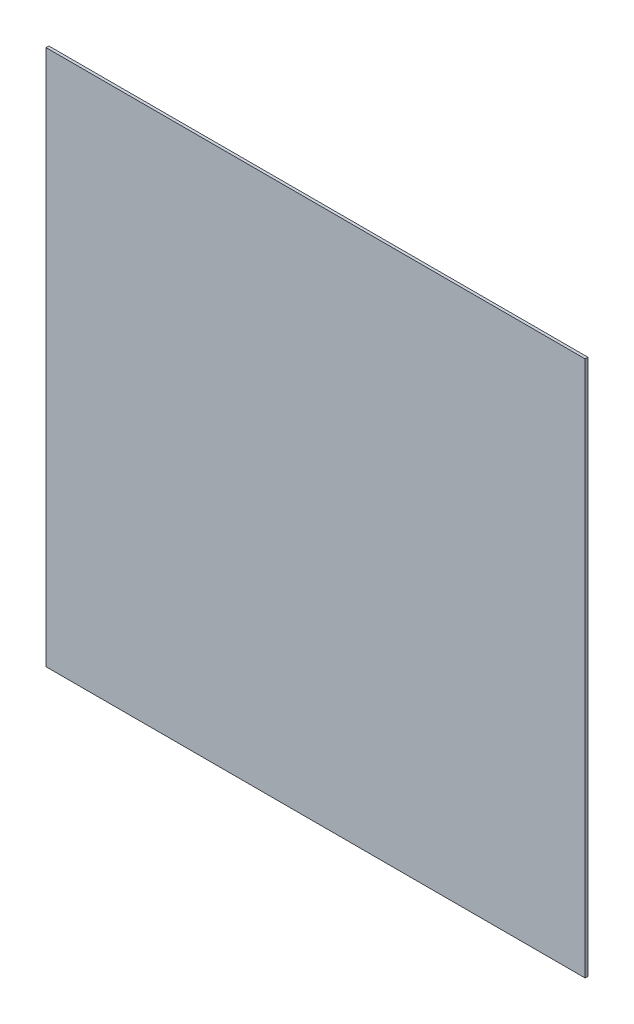
ISO-10303-21;
HEADER;
FILE_DESCRIPTION(('STEP AP214'),'2;1');
FILE_NAME('part.step','',(''),(''),'','','');
FILE_SCHEMA(('AUTOMOTIVE_DESIGN { 1 0 10303 214 1 1 1 1 }'));
ENDSEC;
DATA;
#1=APPLICATION_CONTEXT('core data for automotive mechanical design processes');
#2=APPLICATION_PROTOCOL_DEFINITION('international standard','automotive_design',2000,#1);
#3=PRODUCT_CONTEXT('',#1,'mechanical');
#4=PRODUCT('Part','Part','',(#3));
#5=PRODUCT_RELATED_PRODUCT_CATEGORY('part','',(#4));
#6=PRODUCT_DEFINITION_FORMATION('','',#4);
#7=PRODUCT_DEFINITION_CONTEXT('part definition',#1,'design');
#8=PRODUCT_DEFINITION('design','',#6,#7);
#9=PRODUCT_DEFINITION_SHAPE('','',#8);
#10=(LENGTH_UNIT() NAMED_UNIT(*) SI_UNIT(.MILLI.,.METRE.));
#11=(NAMED_UNIT(*) PLANE_ANGLE_UNIT() SI_UNIT($,.RADIAN.));
#12=(NAMED_UNIT(*) SI_UNIT($,.STERADIAN.) SOLID_ANGLE_UNIT());
#13=UNCERTAINTY_MEASURE_WITH_UNIT(LENGTH_MEASURE(1.E-05),#10,'distance_accuracy_value','');
#14=(GEOMETRIC_REPRESENTATION_CONTEXT(3) GLOBAL_UNCERTAINTY_ASSIGNED_CONTEXT((#13)) GLOBAL_UNIT_ASSIGNED_CONTEXT((#10,
#11,#12)) REPRESENTATION_CONTEXT('',''));
#15=CARTESIAN_POINT('',(0.,0.,0.));
#16=DIRECTION('',(0.,0.,1.));
#17=DIRECTION('',(1.,0.,0.));
#18=AXIS2_PLACEMENT_3D('',#15,#16,#17);
#19=CARTESIAN_POINT('',(304.8,-303.2125,3.175));
#20=DIRECTION('',(-1.,0.,0.));
#21=DIRECTION('',(0.,0.,1.));
#22=AXIS2_PLACEMENT_3D('',#19,#20,#21);
#23=PLANE('',#22);
#24=DIRECTION('',(0.,1.,0.));
#25=VECTOR('',#24,1.);
#26=CARTESIAN_POINT('',(304.8,-303.2125,0.));
#27=LINE('',#26,#25);
#28=CARTESIAN_POINT('',(304.8,-303.2125,0.));
#29=VERTEX_POINT('',#28);
#30=CARTESIAN_POINT('',(304.8,303.2125,0.));
#31=VERTEX_POINT('',#30);
#32=EDGE_CURVE('E102',#29,#31,#27,.T.);
#33=ORIENTED_EDGE('',*,*,#32,.T.);
#34=DIRECTION('',(0.,0.,-1.));
#35=VECTOR('',#34,1.);
#36=CARTESIAN_POINT('',(304.8,303.2125,3.175));
#37=LINE('',#36,#35);
#38=CARTESIAN_POINT('',(304.8,303.2125,3.175));
#39=VERTEX_POINT('',#38);
#40=EDGE_CURVE('E11',#39,#31,#37,.T.);
#41=ORIENTED_EDGE('',*,*,#40,.F.);
#42=DIRECTION('',(0.,1.,0.));
#43=VECTOR('',#42,1.);
#44=CARTESIAN_POINT('',(304.8,-303.2125,3.175));
#45=LINE('',#44,#43);
#46=CARTESIAN_POINT('',(304.8,-303.2125,3.175));
#47=VERTEX_POINT('',#46);
#48=EDGE_CURVE('E90',#47,#39,#45,.T.);
#49=ORIENTED_EDGE('',*,*,#48,.F.);
#50=DIRECTION('',(0.,0.,-1.));
#51=VECTOR('',#50,1.);
#52=CARTESIAN_POINT('',(304.8,-303.2125,3.175));
#53=LINE('',#52,#51);
#54=EDGE_CURVE('E98',#47,#29,#53,.T.);
#55=ORIENTED_EDGE('',*,*,#54,.T.);
#56=EDGE_LOOP('',(#33,#41,#49,#55));
#57=FACE_BOUND('',#56,.T.);
#58=ADVANCED_FACE('F39',(#57),#23,.F.);
#59=CARTESIAN_POINT('',(-304.8,303.2125,3.175));
#60=DIRECTION('',(0.,-1.,0.));
#61=DIRECTION('',(0.,0.,-1.));
#62=AXIS2_PLACEMENT_3D('',#59,#60,#61);
#63=PLANE('',#62);
#64=DIRECTION('',(-1.,0.,0.));
#65=VECTOR('',#64,1.);
#66=CARTESIAN_POINT('',(-304.8,303.2125,0.));
#67=LINE('',#66,#65);
#68=CARTESIAN_POINT('',(-304.8,303.2125,0.));
#69=VERTEX_POINT('',#68);
#70=EDGE_CURVE('E94',#31,#69,#67,.T.);
#71=ORIENTED_EDGE('',*,*,#70,.T.);
#72=DIRECTION('',(0.,0.,-1.));
#73=VECTOR('',#72,1.);
#74=CARTESIAN_POINT('',(-304.8,303.2125,3.175));
#75=LINE('',#74,#73);
#76=CARTESIAN_POINT('',(-304.8,303.2125,3.175));
#77=VERTEX_POINT('',#76);
#78=EDGE_CURVE('E47',#77,#69,#75,.T.);
#79=ORIENTED_EDGE('',*,*,#78,.F.);
#80=DIRECTION('',(-1.,0.,0.));
#81=VECTOR('',#80,1.);
#82=CARTESIAN_POINT('',(-304.8,303.2125,3.175));
#83=LINE('',#82,#81);
#84=EDGE_CURVE('E85',#39,#77,#83,.T.);
#85=ORIENTED_EDGE('',*,*,#84,.F.);
#86=ORIENTED_EDGE('',*,*,#40,.T.);
#87=EDGE_LOOP('',(#71,#79,#85,#86));
#88=FACE_BOUND('',#87,.T.);
#89=ADVANCED_FACE('F93',(#88),#63,.F.);
#90=CARTESIAN_POINT('',(-304.8,-303.2125,3.175));
#91=DIRECTION('',(1.,0.,0.));
#92=DIRECTION('',(0.,0.,-1.));
#93=AXIS2_PLACEMENT_3D('',#90,#91,#92);
#94=PLANE('',#93);
#95=DIRECTION('',(0.,-1.,0.));
#96=VECTOR('',#95,1.);
#97=CARTESIAN_POINT('',(-304.8,-303.2125,0.));
#98=LINE('',#97,#96);
#99=CARTESIAN_POINT('',(-304.8,-303.2125,0.));
#100=VERTEX_POINT('',#99);
#101=EDGE_CURVE('E72',#69,#100,#98,.T.);
#102=ORIENTED_EDGE('',*,*,#101,.T.);
#103=DIRECTION('',(0.,0.,-1.));
#104=VECTOR('',#103,1.);
#105=CARTESIAN_POINT('',(-304.8,-303.2125,3.175));
#106=LINE('',#105,#104);
#107=CARTESIAN_POINT('',(-304.8,-303.2125,3.175));
#108=VERTEX_POINT('',#107);
#109=EDGE_CURVE('E95',#108,#100,#106,.T.);
#110=ORIENTED_EDGE('',*,*,#109,.F.);
#111=DIRECTION('',(0.,-1.,0.));
#112=VECTOR('',#111,1.);
#113=CARTESIAN_POINT('',(-304.8,-303.2125,3.175));
#114=LINE('',#113,#112);
#115=EDGE_CURVE('E88',#77,#108,#114,.T.);
#116=ORIENTED_EDGE('',*,*,#115,.F.);
#117=ORIENTED_EDGE('',*,*,#78,.T.);
#118=EDGE_LOOP('',(#102,#110,#116,#117));
#119=FACE_BOUND('',#118,.T.);
#120=ADVANCED_FACE('F96',(#119),#94,.F.);
#121=CARTESIAN_POINT('',(-304.8,-303.2125,3.175));
#122=DIRECTION('',(0.,1.,0.));
#123=DIRECTION('',(0.,0.,1.));
#124=AXIS2_PLACEMENT_3D('',#121,#122,#123);
#125=PLANE('',#124);
#126=DIRECTION('',(1.,0.,0.));
#127=VECTOR('',#126,1.);
#128=CARTESIAN_POINT('',(-304.8,-303.2125,0.));
#129=LINE('',#128,#127);
#130=EDGE_CURVE('E78',#100,#29,#129,.T.);
#131=ORIENTED_EDGE('',*,*,#130,.T.);
#132=ORIENTED_EDGE('',*,*,#54,.F.);
#133=DIRECTION('',(1.,0.,0.));
#134=VECTOR('',#133,1.);
#135=CARTESIAN_POINT('',(-304.8,-303.2125,3.175));
#136=LINE('',#135,#134);
#137=EDGE_CURVE('E55',#108,#47,#136,.T.);
#138=ORIENTED_EDGE('',*,*,#137,.F.);
#139=ORIENTED_EDGE('',*,*,#109,.T.);
#140=EDGE_LOOP('',(#131,#132,#138,#139));
#141=FACE_BOUND('',#140,.T.);
#142=ADVANCED_FACE('F109',(#141),#125,.F.);
#143=CARTESIAN_POINT('',(0.,0.,3.175));
#144=DIRECTION('',(0.,0.,-1.));
#145=DIRECTION('',(-1.,0.,0.));
#146=AXIS2_PLACEMENT_3D('',#143,#144,#145);
#147=PLANE('',#146);
#148=ORIENTED_EDGE('',*,*,#48,.T.);
#149=ORIENTED_EDGE('',*,*,#84,.T.);
#150=ORIENTED_EDGE('',*,*,#115,.T.);
#151=ORIENTED_EDGE('',*,*,#137,.T.);
#152=EDGE_LOOP('',(#148,#149,#150,#151));
#153=FACE_BOUND('',#152,.T.);
#154=ADVANCED_FACE('F86',(#153),#147,.F.);
#155=CARTESIAN_POINT('',(0.,0.,0.));
#156=DIRECTION('',(0.,0.,-1.));
#157=DIRECTION('',(-1.,0.,0.));
#158=AXIS2_PLACEMENT_3D('',#155,#156,#157);
#159=PLANE('',#158);
#160=ORIENTED_EDGE('',*,*,#32,.F.);
#161=ORIENTED_EDGE('',*,*,#130,.F.);
#162=ORIENTED_EDGE('',*,*,#101,.F.);
#163=ORIENTED_EDGE('',*,*,#70,.F.);
#164=EDGE_LOOP('',(#160,#161,#162,#163));
#165=FACE_BOUND('',#164,.T.);
#166=ADVANCED_FACE('F112',(#165),#159,.T.);
#167=CLOSED_SHELL('',(#58,#89,#120,#142,#154,#166));
#168=MANIFOLD_SOLID_BREP('B2',#167);
#169=ADVANCED_BREP_SHAPE_REPRESENTATION('',(#18,#168),#14);
#170=SHAPE_DEFINITION_REPRESENTATION(#9,#169);
ENDSEC;
END-ISO-10303-21;
